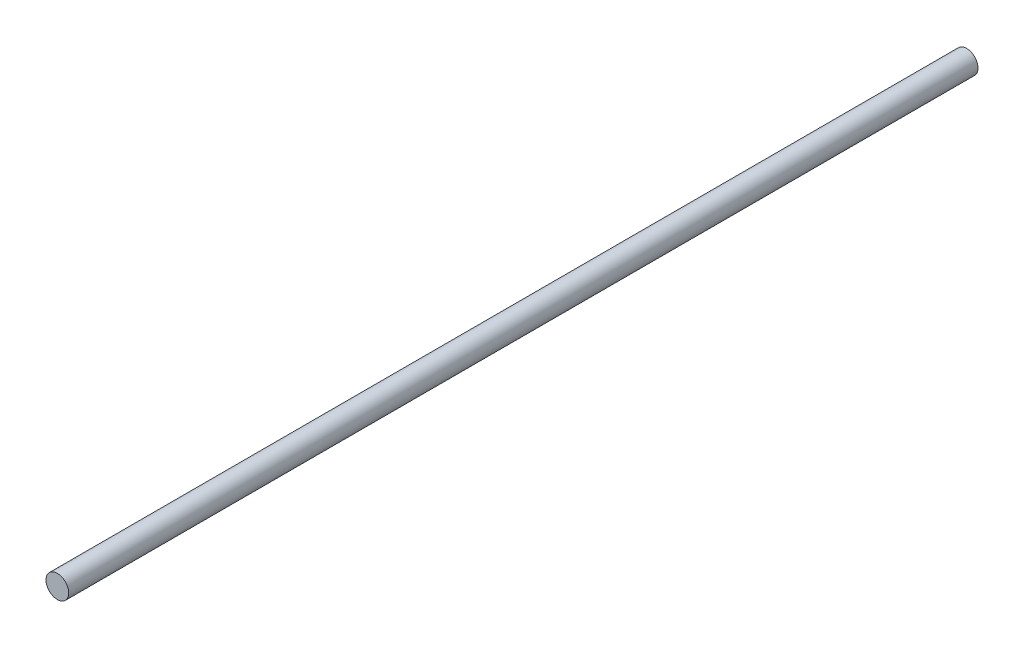
ISO-10303-21;
HEADER;
FILE_DESCRIPTION(('STEP AP214'),'2;1');
FILE_NAME('part.step','',(''),(''),'','','');
FILE_SCHEMA(('AUTOMOTIVE_DESIGN { 1 0 10303 214 1 1 1 1 }'));
ENDSEC;
DATA;
#1=APPLICATION_CONTEXT('core data for automotive mechanical design processes');
#2=APPLICATION_PROTOCOL_DEFINITION('international standard','automotive_design',2000,#1);
#3=PRODUCT_CONTEXT('',#1,'mechanical');
#4=PRODUCT('Part','Part','',(#3));
#5=PRODUCT_RELATED_PRODUCT_CATEGORY('part','',(#4));
#6=PRODUCT_DEFINITION_FORMATION('','',#4);
#7=PRODUCT_DEFINITION_CONTEXT('part definition',#1,'design');
#8=PRODUCT_DEFINITION('design','',#6,#7);
#9=PRODUCT_DEFINITION_SHAPE('','',#8);
#10=(LENGTH_UNIT() NAMED_UNIT(*) SI_UNIT(.MILLI.,.METRE.));
#11=(NAMED_UNIT(*) PLANE_ANGLE_UNIT() SI_UNIT($,.RADIAN.));
#12=(NAMED_UNIT(*) SI_UNIT($,.STERADIAN.) SOLID_ANGLE_UNIT());
#13=UNCERTAINTY_MEASURE_WITH_UNIT(LENGTH_MEASURE(1.E-05),#10,'distance_accuracy_value','');
#14=(GEOMETRIC_REPRESENTATION_CONTEXT(3) GLOBAL_UNCERTAINTY_ASSIGNED_CONTEXT((#13)) GLOBAL_UNIT_ASSIGNED_CONTEXT((#10,
#11,#12)) REPRESENTATION_CONTEXT('',''));
#15=CARTESIAN_POINT('',(0.,0.,0.));
#16=DIRECTION('',(0.,0.,1.));
#17=DIRECTION('',(1.,0.,0.));
#18=AXIS2_PLACEMENT_3D('',#15,#16,#17);
#19=CARTESIAN_POINT('',(0.,0.,600.));
#20=DIRECTION('',(0.,0.,-1.));
#21=DIRECTION('',(-1.,0.,0.));
#22=AXIS2_PLACEMENT_3D('',#19,#20,#21);
#23=CYLINDRICAL_SURFACE('',#22,7.50000000000001);
#24=CARTESIAN_POINT('',(0.,0.,600.));
#25=DIRECTION('',(0.,0.,1.));
#26=DIRECTION('',(1.,0.,0.));
#27=AXIS2_PLACEMENT_3D('',#24,#25,#26);
#28=CIRCLE('',#27,7.50000000000001);
#29=CARTESIAN_POINT('',(7.50000000000001,0.,600.));
#30=VERTEX_POINT('',#29);
#31=EDGE_CURVE('E10',#30,#30,#28,.T.);
#32=ORIENTED_EDGE('',*,*,#31,.F.);
#33=EDGE_LOOP('',(#32));
#34=FACE_BOUND('',#33,.T.);
#35=CARTESIAN_POINT('',(0.,0.,0.));
#36=DIRECTION('',(0.,0.,1.));
#37=DIRECTION('',(1.,0.,0.));
#38=AXIS2_PLACEMENT_3D('',#35,#36,#37);
#39=CIRCLE('',#38,7.50000000000001);
#40=CARTESIAN_POINT('',(7.50000000000001,0.,0.));
#41=VERTEX_POINT('',#40);
#42=EDGE_CURVE('E34',#41,#41,#39,.T.);
#43=ORIENTED_EDGE('',*,*,#42,.T.);
#44=EDGE_LOOP('',(#43));
#45=FACE_BOUND('',#44,.T.);
#46=ADVANCED_FACE('F31',(#34,#45),#23,.T.);
#47=CARTESIAN_POINT('',(0.,0.,600.));
#48=DIRECTION('',(0.,0.,1.));
#49=DIRECTION('',(1.,0.,0.));
#50=AXIS2_PLACEMENT_3D('',#47,#48,#49);
#51=PLANE('',#50);
#52=ORIENTED_EDGE('',*,*,#31,.T.);
#53=EDGE_LOOP('',(#52));
#54=FACE_BOUND('',#53,.T.);
#55=ADVANCED_FACE('F46',(#54),#51,.T.);
#56=CARTESIAN_POINT('',(0.,0.,0.));
#57=DIRECTION('',(0.,0.,1.));
#58=DIRECTION('',(1.,0.,0.));
#59=AXIS2_PLACEMENT_3D('',#56,#57,#58);
#60=PLANE('',#59);
#61=ORIENTED_EDGE('',*,*,#42,.F.);
#62=EDGE_LOOP('',(#61));
#63=FACE_BOUND('',#62,.T.);
#64=ADVANCED_FACE('F44',(#63),#60,.F.);
#65=CLOSED_SHELL('',(#46,#55,#64));
#66=MANIFOLD_SOLID_BREP('B2',#65);
#67=ADVANCED_BREP_SHAPE_REPRESENTATION('',(#18,#66),#14);
#68=SHAPE_DEFINITION_REPRESENTATION(#9,#67);
ENDSEC;
END-ISO-10303-21;
